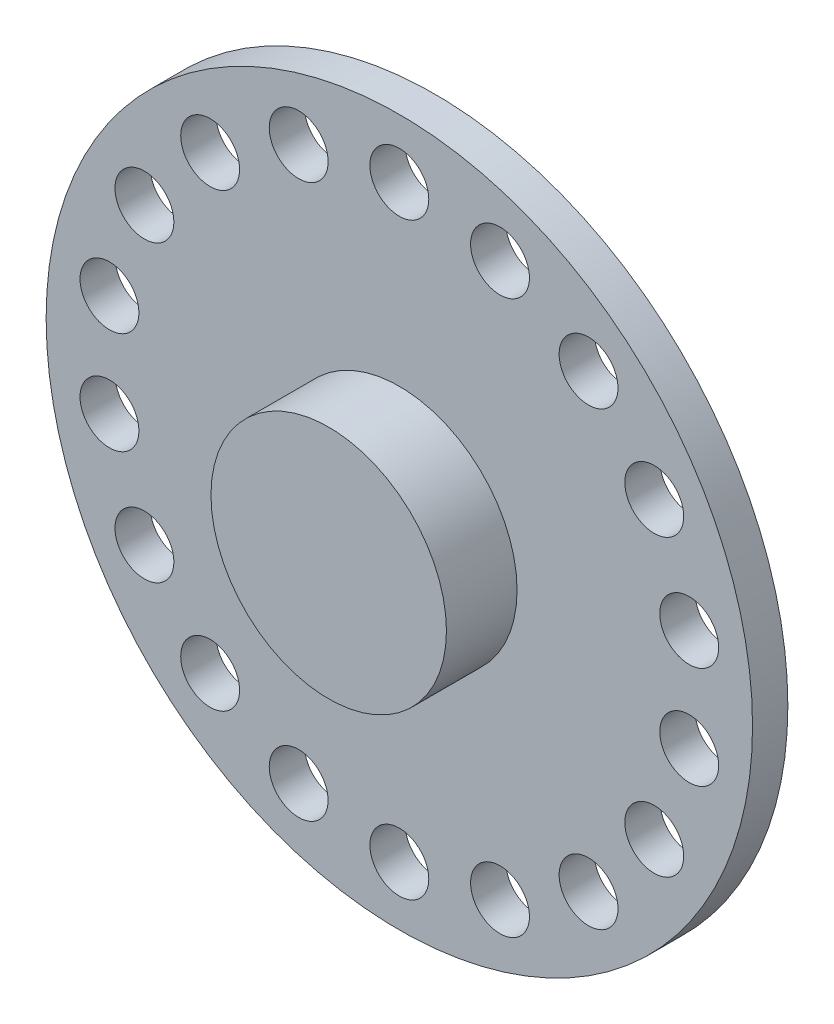
ISO-10303-21;
HEADER;
FILE_DESCRIPTION(('STEP AP214'),'2;1');
FILE_NAME('part.step','',(''),(''),'','','');
FILE_SCHEMA(('AUTOMOTIVE_DESIGN { 1 0 10303 214 1 1 1 1 }'));
ENDSEC;
DATA;
#1=APPLICATION_CONTEXT('core data for automotive mechanical design processes');
#2=APPLICATION_PROTOCOL_DEFINITION('international standard','automotive_design',2000,#1);
#3=PRODUCT_CONTEXT('',#1,'mechanical');
#4=PRODUCT('Part','Part','',(#3));
#5=PRODUCT_RELATED_PRODUCT_CATEGORY('part','',(#4));
#6=PRODUCT_DEFINITION_FORMATION('','',#4);
#7=PRODUCT_DEFINITION_CONTEXT('part definition',#1,'design');
#8=PRODUCT_DEFINITION('design','',#6,#7);
#9=PRODUCT_DEFINITION_SHAPE('','',#8);
#10=(LENGTH_UNIT() NAMED_UNIT(*) SI_UNIT(.MILLI.,.METRE.));
#11=(NAMED_UNIT(*) PLANE_ANGLE_UNIT() SI_UNIT($,.RADIAN.));
#12=(NAMED_UNIT(*) SI_UNIT($,.STERADIAN.) SOLID_ANGLE_UNIT());
#13=UNCERTAINTY_MEASURE_WITH_UNIT(LENGTH_MEASURE(1.E-05),#10,'distance_accuracy_value','');
#14=(GEOMETRIC_REPRESENTATION_CONTEXT(3) GLOBAL_UNCERTAINTY_ASSIGNED_CONTEXT((#13)) GLOBAL_UNIT_ASSIGNED_CONTEXT((#10,
#11,#12)) REPRESENTATION_CONTEXT('',''));
#15=CARTESIAN_POINT('',(0.,0.,0.));
#16=DIRECTION('',(0.,0.,1.));
#17=DIRECTION('',(1.,0.,0.));
#18=AXIS2_PLACEMENT_3D('',#15,#16,#17);
#19=CARTESIAN_POINT('',(0.,0.,3.));
#20=DIRECTION('',(0.,0.,-1.));
#21=DIRECTION('',(-1.,0.,0.));
#22=AXIS2_PLACEMENT_3D('',#19,#20,#21);
#23=CYLINDRICAL_SURFACE('',#22,30.);
#24=CARTESIAN_POINT('',(0.,0.,3.));
#25=DIRECTION('',(0.,0.,1.));
#26=DIRECTION('',(1.,0.,0.));
#27=AXIS2_PLACEMENT_3D('',#24,#25,#26);
#28=CIRCLE('',#27,30.);
#29=CARTESIAN_POINT('',(30.,0.,3.));
#30=VERTEX_POINT('',#29);
#31=EDGE_CURVE('E49',#30,#30,#28,.T.);
#32=ORIENTED_EDGE('',*,*,#31,.F.);
#33=EDGE_LOOP('',(#32));
#34=FACE_BOUND('',#33,.T.);
#35=CARTESIAN_POINT('',(0.,0.,0.));
#36=DIRECTION('',(0.,0.,1.));
#37=DIRECTION('',(1.,0.,0.));
#38=AXIS2_PLACEMENT_3D('',#35,#36,#37);
#39=CIRCLE('',#38,30.);
#40=CARTESIAN_POINT('',(30.,0.,0.));
#41=VERTEX_POINT('',#40);
#42=EDGE_CURVE('E44',#41,#41,#39,.T.);
#43=ORIENTED_EDGE('',*,*,#42,.T.);
#44=EDGE_LOOP('',(#43));
#45=FACE_BOUND('',#44,.T.);
#46=ADVANCED_FACE('F41',(#34,#45),#23,.T.);
#47=CARTESIAN_POINT('',(0.,0.,3.));
#48=DIRECTION('',(0.,0.,1.));
#49=DIRECTION('',(1.,0.,0.));
#50=AXIS2_PLACEMENT_3D('',#47,#48,#49);
#51=PLANE('',#50);
#52=CARTESIAN_POINT('',(-8.55050358314173,23.4923155196477,3.));
#53=DIRECTION('',(0.,0.,1.));
#54=DIRECTION('',(1.,0.,0.));
#55=AXIS2_PLACEMENT_3D('',#52,#53,#54);
#56=CIRCLE('',#55,2.5);
#57=CARTESIAN_POINT('',(-6.05050358314173,23.4923155196477,3.));
#58=VERTEX_POINT('',#57);
#59=EDGE_CURVE('E60',#58,#58,#56,.T.);
#60=ORIENTED_EDGE('',*,*,#59,.F.);
#61=EDGE_LOOP('',(#60));
#62=FACE_BOUND('',#61,.T.);
#63=CARTESIAN_POINT('',(-16.0696902421635,19.1511110779744,3.));
#64=DIRECTION('',(0.,0.,1.));
#65=DIRECTION('',(1.,0.,0.));
#66=AXIS2_PLACEMENT_3D('',#63,#64,#65);
#67=CIRCLE('',#66,2.5);
#68=CARTESIAN_POINT('',(-13.5696902421635,19.1511110779744,3.));
#69=VERTEX_POINT('',#68);
#70=EDGE_CURVE('E64',#69,#69,#67,.T.);
#71=ORIENTED_EDGE('',*,*,#70,.F.);
#72=EDGE_LOOP('',(#71));
#73=FACE_BOUND('',#72,.T.);
#74=CARTESIAN_POINT('',(-21.650635094611,12.5,3.));
#75=DIRECTION('',(0.,0.,1.));
#76=DIRECTION('',(1.,0.,0.));
#77=AXIS2_PLACEMENT_3D('',#74,#75,#76);
#78=CIRCLE('',#77,2.5);
#79=CARTESIAN_POINT('',(-19.150635094611,12.5,3.));
#80=VERTEX_POINT('',#79);
#81=EDGE_CURVE('E68',#80,#80,#78,.T.);
#82=ORIENTED_EDGE('',*,*,#81,.F.);
#83=EDGE_LOOP('',(#82));
#84=FACE_BOUND('',#83,.T.);
#85=CARTESIAN_POINT('',(-24.6201938253052,4.34120444167318,3.));
#86=DIRECTION('',(0.,0.,1.));
#87=DIRECTION('',(1.,0.,0.));
#88=AXIS2_PLACEMENT_3D('',#85,#86,#87);
#89=CIRCLE('',#88,2.5);
#90=CARTESIAN_POINT('',(-22.1201938253052,4.34120444167318,3.));
#91=VERTEX_POINT('',#90);
#92=EDGE_CURVE('E72',#91,#91,#89,.T.);
#93=ORIENTED_EDGE('',*,*,#92,.F.);
#94=EDGE_LOOP('',(#93));
#95=FACE_BOUND('',#94,.T.);
#96=CARTESIAN_POINT('',(-24.6201938253052,-4.34120444167335,3.));
#97=DIRECTION('',(0.,0.,1.));
#98=DIRECTION('',(1.,0.,0.));
#99=AXIS2_PLACEMENT_3D('',#96,#97,#98);
#100=CIRCLE('',#99,2.5);
#101=CARTESIAN_POINT('',(-22.1201938253052,-4.34120444167335,3.));
#102=VERTEX_POINT('',#101);
#103=EDGE_CURVE('E76',#102,#102,#100,.T.);
#104=ORIENTED_EDGE('',*,*,#103,.F.);
#105=EDGE_LOOP('',(#104));
#106=FACE_BOUND('',#105,.T.);
#107=CARTESIAN_POINT('',(-21.6506350946109,-12.5000000000001,3.));
#108=DIRECTION('',(0.,0.,1.));
#109=DIRECTION('',(1.,0.,0.));
#110=AXIS2_PLACEMENT_3D('',#107,#108,#109);
#111=CIRCLE('',#110,2.5);
#112=CARTESIAN_POINT('',(-19.1506350946109,-12.5000000000001,3.));
#113=VERTEX_POINT('',#112);
#114=EDGE_CURVE('E80',#113,#113,#111,.T.);
#115=ORIENTED_EDGE('',*,*,#114,.F.);
#116=EDGE_LOOP('',(#115));
#117=FACE_BOUND('',#116,.T.);
#118=CARTESIAN_POINT('',(-16.0696902421634,-19.1511110779745,3.));
#119=DIRECTION('',(0.,0.,1.));
#120=DIRECTION('',(1.,0.,0.));
#121=AXIS2_PLACEMENT_3D('',#118,#119,#120);
#122=CIRCLE('',#121,2.5);
#123=CARTESIAN_POINT('',(-13.5696902421634,-19.1511110779745,3.));
#124=VERTEX_POINT('',#123);
#125=EDGE_CURVE('E84',#124,#124,#122,.T.);
#126=ORIENTED_EDGE('',*,*,#125,.F.);
#127=EDGE_LOOP('',(#126));
#128=FACE_BOUND('',#127,.T.);
#129=CARTESIAN_POINT('',(-8.55050358314158,-23.4923155196478,3.));
#130=DIRECTION('',(0.,0.,1.));
#131=DIRECTION('',(1.,0.,0.));
#132=AXIS2_PLACEMENT_3D('',#129,#130,#131);
#133=CIRCLE('',#132,2.5);
#134=CARTESIAN_POINT('',(-6.05050358314158,-23.4923155196478,3.));
#135=VERTEX_POINT('',#134);
#136=EDGE_CURVE('E88',#135,#135,#133,.T.);
#137=ORIENTED_EDGE('',*,*,#136,.F.);
#138=EDGE_LOOP('',(#137));
#139=FACE_BOUND('',#138,.T.);
#140=CARTESIAN_POINT('',(1.74574066942157E-13,-25.,3.));
#141=DIRECTION('',(0.,0.,1.));
#142=DIRECTION('',(1.,0.,0.));
#143=AXIS2_PLACEMENT_3D('',#140,#141,#142);
#144=CIRCLE('',#143,2.5);
#145=CARTESIAN_POINT('',(2.50000000000017,-25.,3.));
#146=VERTEX_POINT('',#145);
#147=EDGE_CURVE('E92',#146,#146,#144,.T.);
#148=ORIENTED_EDGE('',*,*,#147,.F.);
#149=EDGE_LOOP('',(#148));
#150=FACE_BOUND('',#149,.T.);
#151=CARTESIAN_POINT('',(8.5505035831419,-23.4923155196476,3.));
#152=DIRECTION('',(0.,0.,1.));
#153=DIRECTION('',(1.,0.,0.));
#154=AXIS2_PLACEMENT_3D('',#151,#152,#153);
#155=CIRCLE('',#154,2.5);
#156=CARTESIAN_POINT('',(11.0505035831419,-23.4923155196476,3.));
#157=VERTEX_POINT('',#156);
#158=EDGE_CURVE('E96',#157,#157,#155,.T.);
#159=ORIENTED_EDGE('',*,*,#158,.F.);
#160=EDGE_LOOP('',(#159));
#161=FACE_BOUND('',#160,.T.);
#162=CARTESIAN_POINT('',(16.0696902421637,-19.1511110779743,3.));
#163=DIRECTION('',(0.,0.,1.));
#164=DIRECTION('',(1.,0.,0.));
#165=AXIS2_PLACEMENT_3D('',#162,#163,#164);
#166=CIRCLE('',#165,2.5);
#167=CARTESIAN_POINT('',(18.5696902421637,-19.1511110779743,3.));
#168=VERTEX_POINT('',#167);
#169=EDGE_CURVE('E100',#168,#168,#166,.T.);
#170=ORIENTED_EDGE('',*,*,#169,.F.);
#171=EDGE_LOOP('',(#170));
#172=FACE_BOUND('',#171,.T.);
#173=CARTESIAN_POINT('',(21.6506350946111,-12.4999999999998,3.));
#174=DIRECTION('',(0.,0.,1.));
#175=DIRECTION('',(1.,0.,0.));
#176=AXIS2_PLACEMENT_3D('',#173,#174,#175);
#177=CIRCLE('',#176,2.5);
#178=CARTESIAN_POINT('',(24.1506350946111,-12.4999999999998,3.));
#179=VERTEX_POINT('',#178);
#180=EDGE_CURVE('E104',#179,#179,#177,.T.);
#181=ORIENTED_EDGE('',*,*,#180,.F.);
#182=EDGE_LOOP('',(#181));
#183=FACE_BOUND('',#182,.T.);
#184=CARTESIAN_POINT('',(24.6201938253052,-4.34120444167302,3.));
#185=DIRECTION('',(0.,0.,1.));
#186=DIRECTION('',(1.,0.,0.));
#187=AXIS2_PLACEMENT_3D('',#184,#185,#186);
#188=CIRCLE('',#187,2.5);
#189=CARTESIAN_POINT('',(27.1201938253052,-4.34120444167302,3.));
#190=VERTEX_POINT('',#189);
#191=EDGE_CURVE('E108',#190,#190,#188,.T.);
#192=ORIENTED_EDGE('',*,*,#191,.F.);
#193=EDGE_LOOP('',(#192));
#194=FACE_BOUND('',#193,.T.);
#195=CARTESIAN_POINT('',(24.6201938253052,4.34120444167351,3.));
#196=DIRECTION('',(0.,0.,1.));
#197=DIRECTION('',(1.,0.,0.));
#198=AXIS2_PLACEMENT_3D('',#195,#196,#197);
#199=CIRCLE('',#198,2.5);
#200=CARTESIAN_POINT('',(27.1201938253052,4.34120444167351,3.));
#201=VERTEX_POINT('',#200);
#202=EDGE_CURVE('E112',#201,#201,#199,.T.);
#203=ORIENTED_EDGE('',*,*,#202,.F.);
#204=EDGE_LOOP('',(#203));
#205=FACE_BOUND('',#204,.T.);
#206=CARTESIAN_POINT('',(21.6506350946108,12.5000000000003,3.));
#207=DIRECTION('',(0.,0.,1.));
#208=DIRECTION('',(1.,0.,0.));
#209=AXIS2_PLACEMENT_3D('',#206,#207,#208);
#210=CIRCLE('',#209,2.5);
#211=CARTESIAN_POINT('',(24.1506350946108,12.5000000000003,3.));
#212=VERTEX_POINT('',#211);
#213=EDGE_CURVE('E116',#212,#212,#210,.T.);
#214=ORIENTED_EDGE('',*,*,#213,.F.);
#215=EDGE_LOOP('',(#214));
#216=FACE_BOUND('',#215,.T.);
#217=CARTESIAN_POINT('',(16.0696902421633,19.1511110779747,3.));
#218=DIRECTION('',(0.,0.,1.));
#219=DIRECTION('',(1.,0.,0.));
#220=AXIS2_PLACEMENT_3D('',#217,#218,#219);
#221=CIRCLE('',#220,2.5);
#222=CARTESIAN_POINT('',(18.5696902421633,19.1511110779747,3.));
#223=VERTEX_POINT('',#222);
#224=EDGE_CURVE('E120',#223,#223,#221,.T.);
#225=ORIENTED_EDGE('',*,*,#224,.F.);
#226=EDGE_LOOP('',(#225));
#227=FACE_BOUND('',#226,.T.);
#228=CARTESIAN_POINT('',(8.55050358314142,23.4923155196478,3.));
#229=DIRECTION('',(0.,0.,1.));
#230=DIRECTION('',(1.,0.,0.));
#231=AXIS2_PLACEMENT_3D('',#228,#229,#230);
#232=CIRCLE('',#231,2.5);
#233=CARTESIAN_POINT('',(11.0505035831414,23.4923155196478,3.));
#234=VERTEX_POINT('',#233);
#235=EDGE_CURVE('E124',#234,#234,#232,.T.);
#236=ORIENTED_EDGE('',*,*,#235,.F.);
#237=EDGE_LOOP('',(#236));
#238=FACE_BOUND('',#237,.T.);
#239=CARTESIAN_POINT('',(0.,25.,3.));
#240=DIRECTION('',(0.,0.,1.));
#241=DIRECTION('',(1.,0.,0.));
#242=AXIS2_PLACEMENT_3D('',#239,#240,#241);
#243=CIRCLE('',#242,2.5);
#244=CARTESIAN_POINT('',(2.5,25.,3.));
#245=VERTEX_POINT('',#244);
#246=EDGE_CURVE('E128',#245,#245,#243,.T.);
#247=ORIENTED_EDGE('',*,*,#246,.F.);
#248=EDGE_LOOP('',(#247));
#249=FACE_BOUND('',#248,.T.);
#250=CARTESIAN_POINT('',(0.,0.,3.));
#251=DIRECTION('',(0.,0.,1.));
#252=DIRECTION('',(1.,0.,0.));
#253=AXIS2_PLACEMENT_3D('',#250,#251,#252);
#254=CIRCLE('',#253,10.);
#255=CARTESIAN_POINT('',(10.,0.,3.));
#256=VERTEX_POINT('',#255);
#257=EDGE_CURVE('E10',#256,#256,#254,.T.);
#258=ORIENTED_EDGE('',*,*,#257,.F.);
#259=EDGE_LOOP('',(#258));
#260=FACE_BOUND('',#259,.T.);
#261=ORIENTED_EDGE('',*,*,#31,.T.);
#262=EDGE_LOOP('',(#261));
#263=FACE_BOUND('',#262,.T.);
#264=ADVANCED_FACE('F211',(#62,#73,#84,#95,#106,#117,#128,#139,#150,#161,#172,#183,#194,#205,
#216,#227,#238,#249,#260,#263),#51,.T.);
#265=CARTESIAN_POINT('',(0.,0.,0.));
#266=DIRECTION('',(0.,0.,1.));
#267=DIRECTION('',(1.,0.,0.));
#268=AXIS2_PLACEMENT_3D('',#265,#266,#267);
#269=PLANE('',#268);
#270=CARTESIAN_POINT('',(-8.55050358314173,23.4923155196477,0.));
#271=DIRECTION('',(0.,0.,-1.));
#272=DIRECTION('',(-1.,0.,0.));
#273=AXIS2_PLACEMENT_3D('',#270,#271,#272);
#274=CIRCLE('',#273,2.5);
#275=CARTESIAN_POINT('',(-11.0505035831417,23.4923155196477,0.));
#276=VERTEX_POINT('',#275);
#277=EDGE_CURVE('E136',#276,#276,#274,.T.);
#278=ORIENTED_EDGE('',*,*,#277,.F.);
#279=EDGE_LOOP('',(#278));
#280=FACE_BOUND('',#279,.T.);
#281=CARTESIAN_POINT('',(-16.0696902421635,19.1511110779744,0.));
#282=DIRECTION('',(0.,0.,-1.));
#283=DIRECTION('',(-1.,0.,0.));
#284=AXIS2_PLACEMENT_3D('',#281,#282,#283);
#285=CIRCLE('',#284,2.5);
#286=CARTESIAN_POINT('',(-18.5696902421635,19.1511110779744,0.));
#287=VERTEX_POINT('',#286);
#288=EDGE_CURVE('E194',#287,#287,#285,.T.);
#289=ORIENTED_EDGE('',*,*,#288,.F.);
#290=EDGE_LOOP('',(#289));
#291=FACE_BOUND('',#290,.T.);
#292=CARTESIAN_POINT('',(-21.650635094611,12.5,0.));
#293=DIRECTION('',(0.,0.,-1.));
#294=DIRECTION('',(-1.,0.,0.));
#295=AXIS2_PLACEMENT_3D('',#292,#293,#294);
#296=CIRCLE('',#295,2.5);
#297=CARTESIAN_POINT('',(-24.150635094611,12.5,0.));
#298=VERTEX_POINT('',#297);
#299=EDGE_CURVE('E190',#298,#298,#296,.T.);
#300=ORIENTED_EDGE('',*,*,#299,.F.);
#301=EDGE_LOOP('',(#300));
#302=FACE_BOUND('',#301,.T.);
#303=CARTESIAN_POINT('',(-24.6201938253052,4.34120444167318,0.));
#304=DIRECTION('',(0.,0.,-1.));
#305=DIRECTION('',(-1.,0.,0.));
#306=AXIS2_PLACEMENT_3D('',#303,#304,#305);
#307=CIRCLE('',#306,2.5);
#308=CARTESIAN_POINT('',(-27.1201938253052,4.34120444167318,0.));
#309=VERTEX_POINT('',#308);
#310=EDGE_CURVE('E186',#309,#309,#307,.T.);
#311=ORIENTED_EDGE('',*,*,#310,.F.);
#312=EDGE_LOOP('',(#311));
#313=FACE_BOUND('',#312,.T.);
#314=CARTESIAN_POINT('',(-24.6201938253052,-4.34120444167335,0.));
#315=DIRECTION('',(0.,0.,-1.));
#316=DIRECTION('',(-1.,0.,0.));
#317=AXIS2_PLACEMENT_3D('',#314,#315,#316);
#318=CIRCLE('',#317,2.5);
#319=CARTESIAN_POINT('',(-27.1201938253052,-4.34120444167335,0.));
#320=VERTEX_POINT('',#319);
#321=EDGE_CURVE('E182',#320,#320,#318,.T.);
#322=ORIENTED_EDGE('',*,*,#321,.F.);
#323=EDGE_LOOP('',(#322));
#324=FACE_BOUND('',#323,.T.);
#325=CARTESIAN_POINT('',(-21.6506350946109,-12.5000000000001,0.));
#326=DIRECTION('',(0.,0.,-1.));
#327=DIRECTION('',(-1.,0.,0.));
#328=AXIS2_PLACEMENT_3D('',#325,#326,#327);
#329=CIRCLE('',#328,2.5);
#330=CARTESIAN_POINT('',(-24.1506350946109,-12.5000000000001,0.));
#331=VERTEX_POINT('',#330);
#332=EDGE_CURVE('E178',#331,#331,#329,.T.);
#333=ORIENTED_EDGE('',*,*,#332,.F.);
#334=EDGE_LOOP('',(#333));
#335=FACE_BOUND('',#334,.T.);
#336=CARTESIAN_POINT('',(-16.0696902421634,-19.1511110779745,0.));
#337=DIRECTION('',(0.,0.,-1.));
#338=DIRECTION('',(-1.,0.,0.));
#339=AXIS2_PLACEMENT_3D('',#336,#337,#338);
#340=CIRCLE('',#339,2.5);
#341=CARTESIAN_POINT('',(-18.5696902421634,-19.1511110779745,0.));
#342=VERTEX_POINT('',#341);
#343=EDGE_CURVE('E174',#342,#342,#340,.T.);
#344=ORIENTED_EDGE('',*,*,#343,.F.);
#345=EDGE_LOOP('',(#344));
#346=FACE_BOUND('',#345,.T.);
#347=CARTESIAN_POINT('',(-8.55050358314158,-23.4923155196478,0.));
#348=DIRECTION('',(0.,0.,-1.));
#349=DIRECTION('',(-1.,0.,0.));
#350=AXIS2_PLACEMENT_3D('',#347,#348,#349);
#351=CIRCLE('',#350,2.5);
#352=CARTESIAN_POINT('',(-11.0505035831416,-23.4923155196478,0.));
#353=VERTEX_POINT('',#352);
#354=EDGE_CURVE('E170',#353,#353,#351,.T.);
#355=ORIENTED_EDGE('',*,*,#354,.F.);
#356=EDGE_LOOP('',(#355));
#357=FACE_BOUND('',#356,.T.);
#358=CARTESIAN_POINT('',(1.74574066942157E-13,-25.,0.));
#359=DIRECTION('',(0.,0.,-1.));
#360=DIRECTION('',(-1.,0.,0.));
#361=AXIS2_PLACEMENT_3D('',#358,#359,#360);
#362=CIRCLE('',#361,2.5);
#363=CARTESIAN_POINT('',(-2.49999999999982,-25.,0.));
#364=VERTEX_POINT('',#363);
#365=EDGE_CURVE('E166',#364,#364,#362,.T.);
#366=ORIENTED_EDGE('',*,*,#365,.F.);
#367=EDGE_LOOP('',(#366));
#368=FACE_BOUND('',#367,.T.);
#369=CARTESIAN_POINT('',(8.5505035831419,-23.4923155196476,0.));
#370=DIRECTION('',(0.,0.,-1.));
#371=DIRECTION('',(-1.,0.,0.));
#372=AXIS2_PLACEMENT_3D('',#369,#370,#371);
#373=CIRCLE('',#372,2.5);
#374=CARTESIAN_POINT('',(6.0505035831419,-23.4923155196476,0.));
#375=VERTEX_POINT('',#374);
#376=EDGE_CURVE('E162',#375,#375,#373,.T.);
#377=ORIENTED_EDGE('',*,*,#376,.F.);
#378=EDGE_LOOP('',(#377));
#379=FACE_BOUND('',#378,.T.);
#380=CARTESIAN_POINT('',(16.0696902421637,-19.1511110779743,0.));
#381=DIRECTION('',(0.,0.,-1.));
#382=DIRECTION('',(-1.,0.,0.));
#383=AXIS2_PLACEMENT_3D('',#380,#381,#382);
#384=CIRCLE('',#383,2.5);
#385=CARTESIAN_POINT('',(13.5696902421636,-19.1511110779743,0.));
#386=VERTEX_POINT('',#385);
#387=EDGE_CURVE('E158',#386,#386,#384,.T.);
#388=ORIENTED_EDGE('',*,*,#387,.F.);
#389=EDGE_LOOP('',(#388));
#390=FACE_BOUND('',#389,.T.);
#391=CARTESIAN_POINT('',(21.6506350946111,-12.4999999999998,0.));
#392=DIRECTION('',(0.,0.,-1.));
#393=DIRECTION('',(-1.,0.,0.));
#394=AXIS2_PLACEMENT_3D('',#391,#392,#393);
#395=CIRCLE('',#394,2.5);
#396=CARTESIAN_POINT('',(19.1506350946111,-12.4999999999998,0.));
#397=VERTEX_POINT('',#396);
#398=EDGE_CURVE('E154',#397,#397,#395,.T.);
#399=ORIENTED_EDGE('',*,*,#398,.F.);
#400=EDGE_LOOP('',(#399));
#401=FACE_BOUND('',#400,.T.);
#402=CARTESIAN_POINT('',(24.6201938253052,-4.34120444167302,0.));
#403=DIRECTION('',(0.,0.,-1.));
#404=DIRECTION('',(-1.,0.,0.));
#405=AXIS2_PLACEMENT_3D('',#402,#403,#404);
#406=CIRCLE('',#405,2.5);
#407=CARTESIAN_POINT('',(22.1201938253052,-4.34120444167302,0.));
#408=VERTEX_POINT('',#407);
#409=EDGE_CURVE('E150',#408,#408,#406,.T.);
#410=ORIENTED_EDGE('',*,*,#409,.F.);
#411=EDGE_LOOP('',(#410));
#412=FACE_BOUND('',#411,.T.);
#413=CARTESIAN_POINT('',(24.6201938253052,4.34120444167351,0.));
#414=DIRECTION('',(0.,0.,-1.));
#415=DIRECTION('',(-1.,0.,0.));
#416=AXIS2_PLACEMENT_3D('',#413,#414,#415);
#417=CIRCLE('',#416,2.5);
#418=CARTESIAN_POINT('',(22.1201938253052,4.34120444167351,0.));
#419=VERTEX_POINT('',#418);
#420=EDGE_CURVE('E146',#419,#419,#417,.T.);
#421=ORIENTED_EDGE('',*,*,#420,.F.);
#422=EDGE_LOOP('',(#421));
#423=FACE_BOUND('',#422,.T.);
#424=CARTESIAN_POINT('',(21.6506350946108,12.5000000000003,0.));
#425=DIRECTION('',(0.,0.,-1.));
#426=DIRECTION('',(-1.,0.,0.));
#427=AXIS2_PLACEMENT_3D('',#424,#425,#426);
#428=CIRCLE('',#427,2.5);
#429=CARTESIAN_POINT('',(19.1506350946108,12.5000000000003,0.));
#430=VERTEX_POINT('',#429);
#431=EDGE_CURVE('E141',#430,#430,#428,.T.);
#432=ORIENTED_EDGE('',*,*,#431,.F.);
#433=EDGE_LOOP('',(#432));
#434=FACE_BOUND('',#433,.T.);
#435=CARTESIAN_POINT('',(16.0696902421633,19.1511110779747,0.));
#436=DIRECTION('',(0.,0.,-1.));
#437=DIRECTION('',(-1.,0.,0.));
#438=AXIS2_PLACEMENT_3D('',#435,#436,#437);
#439=CIRCLE('',#438,2.5);
#440=CARTESIAN_POINT('',(13.5696902421633,19.1511110779747,0.));
#441=VERTEX_POINT('',#440);
#442=EDGE_CURVE('E137',#441,#441,#439,.T.);
#443=ORIENTED_EDGE('',*,*,#442,.F.);
#444=EDGE_LOOP('',(#443));
#445=FACE_BOUND('',#444,.T.);
#446=CARTESIAN_POINT('',(8.55050358314142,23.4923155196478,0.));
#447=DIRECTION('',(0.,0.,-1.));
#448=DIRECTION('',(-1.,0.,0.));
#449=AXIS2_PLACEMENT_3D('',#446,#447,#448);
#450=CIRCLE('',#449,2.5);
#451=CARTESIAN_POINT('',(6.05050358314142,23.4923155196478,0.));
#452=VERTEX_POINT('',#451);
#453=EDGE_CURVE('E142',#452,#452,#450,.T.);
#454=ORIENTED_EDGE('',*,*,#453,.F.);
#455=EDGE_LOOP('',(#454));
#456=FACE_BOUND('',#455,.T.);
#457=CARTESIAN_POINT('',(0.,25.,0.));
#458=DIRECTION('',(0.,0.,-1.));
#459=DIRECTION('',(-1.,0.,0.));
#460=AXIS2_PLACEMENT_3D('',#457,#458,#459);
#461=CIRCLE('',#460,2.5);
#462=CARTESIAN_POINT('',(-2.5,25.,0.));
#463=VERTEX_POINT('',#462);
#464=EDGE_CURVE('E132',#463,#463,#461,.T.);
#465=ORIENTED_EDGE('',*,*,#464,.F.);
#466=EDGE_LOOP('',(#465));
#467=FACE_BOUND('',#466,.T.);
#468=ORIENTED_EDGE('',*,*,#42,.F.);
#469=EDGE_LOOP('',(#468));
#470=FACE_BOUND('',#469,.T.);
#471=ADVANCED_FACE('F207',(#280,#291,#302,#313,#324,#335,#346,#357,#368,#379,#390,#401,#412,
#423,#434,#445,#456,#467,#470),#269,.F.);
#472=CARTESIAN_POINT('',(0.,0.,9.));
#473=DIRECTION('',(0.,0.,-1.));
#474=DIRECTION('',(-1.,0.,0.));
#475=AXIS2_PLACEMENT_3D('',#472,#473,#474);
#476=CYLINDRICAL_SURFACE('',#475,10.);
#477=CARTESIAN_POINT('',(0.,0.,9.));
#478=DIRECTION('',(0.,0.,1.));
#479=DIRECTION('',(1.,0.,0.));
#480=AXIS2_PLACEMENT_3D('',#477,#478,#479);
#481=CIRCLE('',#480,10.);
#482=CARTESIAN_POINT('',(10.,0.,9.));
#483=VERTEX_POINT('',#482);
#484=EDGE_CURVE('E56',#483,#483,#481,.T.);
#485=ORIENTED_EDGE('',*,*,#484,.F.);
#486=EDGE_LOOP('',(#485));
#487=FACE_BOUND('',#486,.T.);
#488=ORIENTED_EDGE('',*,*,#257,.T.);
#489=EDGE_LOOP('',(#488));
#490=FACE_BOUND('',#489,.T.);
#491=ADVANCED_FACE('F210',(#487,#490),#476,.T.);
#492=CARTESIAN_POINT('',(0.,0.,9.));
#493=DIRECTION('',(0.,0.,1.));
#494=DIRECTION('',(1.,0.,0.));
#495=AXIS2_PLACEMENT_3D('',#492,#493,#494);
#496=PLANE('',#495);
#497=ORIENTED_EDGE('',*,*,#484,.T.);
#498=EDGE_LOOP('',(#497));
#499=FACE_BOUND('',#498,.T.);
#500=ADVANCED_FACE('F235',(#499),#496,.T.);
#501=CARTESIAN_POINT('',(0.,25.,9.));
#502=DIRECTION('',(0.,0.,-1.));
#503=DIRECTION('',(-1.,0.,0.));
#504=AXIS2_PLACEMENT_3D('',#501,#502,#503);
#505=CYLINDRICAL_SURFACE('',#504,2.5);
#506=ORIENTED_EDGE('',*,*,#246,.T.);
#507=EDGE_LOOP('',(#506));
#508=FACE_BOUND('',#507,.T.);
#509=ORIENTED_EDGE('',*,*,#464,.T.);
#510=EDGE_LOOP('',(#509));
#511=FACE_BOUND('',#510,.T.);
#512=ADVANCED_FACE('F239',(#508,#511),#505,.F.);
#513=CARTESIAN_POINT('',(8.55050358314142,23.4923155196478,9.));
#514=DIRECTION('',(0.,0.,-1.));
#515=DIRECTION('',(-1.,0.,0.));
#516=AXIS2_PLACEMENT_3D('',#513,#514,#515);
#517=CYLINDRICAL_SURFACE('',#516,2.5);
#518=ORIENTED_EDGE('',*,*,#235,.T.);
#519=EDGE_LOOP('',(#518));
#520=FACE_BOUND('',#519,.T.);
#521=ORIENTED_EDGE('',*,*,#453,.T.);
#522=EDGE_LOOP('',(#521));
#523=FACE_BOUND('',#522,.T.);
#524=ADVANCED_FACE('F205',(#520,#523),#517,.F.);
#525=CARTESIAN_POINT('',(16.0696902421633,19.1511110779747,9.));
#526=DIRECTION('',(0.,0.,-1.));
#527=DIRECTION('',(-1.,0.,0.));
#528=AXIS2_PLACEMENT_3D('',#525,#526,#527);
#529=CYLINDRICAL_SURFACE('',#528,2.5);
#530=ORIENTED_EDGE('',*,*,#224,.T.);
#531=EDGE_LOOP('',(#530));
#532=FACE_BOUND('',#531,.T.);
#533=ORIENTED_EDGE('',*,*,#442,.T.);
#534=EDGE_LOOP('',(#533));
#535=FACE_BOUND('',#534,.T.);
#536=ADVANCED_FACE('F244',(#532,#535),#529,.F.);
#537=CARTESIAN_POINT('',(21.6506350946108,12.5000000000003,9.));
#538=DIRECTION('',(0.,0.,-1.));
#539=DIRECTION('',(-1.,0.,0.));
#540=AXIS2_PLACEMENT_3D('',#537,#538,#539);
#541=CYLINDRICAL_SURFACE('',#540,2.5);
#542=ORIENTED_EDGE('',*,*,#213,.T.);
#543=EDGE_LOOP('',(#542));
#544=FACE_BOUND('',#543,.T.);
#545=ORIENTED_EDGE('',*,*,#431,.T.);
#546=EDGE_LOOP('',(#545));
#547=FACE_BOUND('',#546,.T.);
#548=ADVANCED_FACE('F247',(#544,#547),#541,.F.);
#549=CARTESIAN_POINT('',(24.6201938253052,4.34120444167351,9.));
#550=DIRECTION('',(0.,0.,-1.));
#551=DIRECTION('',(-1.,0.,0.));
#552=AXIS2_PLACEMENT_3D('',#549,#550,#551);
#553=CYLINDRICAL_SURFACE('',#552,2.5);
#554=ORIENTED_EDGE('',*,*,#202,.T.);
#555=EDGE_LOOP('',(#554));
#556=FACE_BOUND('',#555,.T.);
#557=ORIENTED_EDGE('',*,*,#420,.T.);
#558=EDGE_LOOP('',(#557));
#559=FACE_BOUND('',#558,.T.);
#560=ADVANCED_FACE('F251',(#556,#559),#553,.F.);
#561=CARTESIAN_POINT('',(24.6201938253052,-4.34120444167302,9.));
#562=DIRECTION('',(0.,0.,-1.));
#563=DIRECTION('',(-1.,0.,0.));
#564=AXIS2_PLACEMENT_3D('',#561,#562,#563);
#565=CYLINDRICAL_SURFACE('',#564,2.5);
#566=ORIENTED_EDGE('',*,*,#191,.T.);
#567=EDGE_LOOP('',(#566));
#568=FACE_BOUND('',#567,.T.);
#569=ORIENTED_EDGE('',*,*,#409,.T.);
#570=EDGE_LOOP('',(#569));
#571=FACE_BOUND('',#570,.T.);
#572=ADVANCED_FACE('F255',(#568,#571),#565,.F.);
#573=CARTESIAN_POINT('',(21.6506350946111,-12.4999999999998,9.));
#574=DIRECTION('',(0.,0.,-1.));
#575=DIRECTION('',(-1.,0.,0.));
#576=AXIS2_PLACEMENT_3D('',#573,#574,#575);
#577=CYLINDRICAL_SURFACE('',#576,2.5);
#578=ORIENTED_EDGE('',*,*,#180,.T.);
#579=EDGE_LOOP('',(#578));
#580=FACE_BOUND('',#579,.T.);
#581=ORIENTED_EDGE('',*,*,#398,.T.);
#582=EDGE_LOOP('',(#581));
#583=FACE_BOUND('',#582,.T.);
#584=ADVANCED_FACE('F259',(#580,#583),#577,.F.);
#585=CARTESIAN_POINT('',(16.0696902421637,-19.1511110779743,9.));
#586=DIRECTION('',(0.,0.,-1.));
#587=DIRECTION('',(-1.,0.,0.));
#588=AXIS2_PLACEMENT_3D('',#585,#586,#587);
#589=CYLINDRICAL_SURFACE('',#588,2.5);
#590=ORIENTED_EDGE('',*,*,#169,.T.);
#591=EDGE_LOOP('',(#590));
#592=FACE_BOUND('',#591,.T.);
#593=ORIENTED_EDGE('',*,*,#387,.T.);
#594=EDGE_LOOP('',(#593));
#595=FACE_BOUND('',#594,.T.);
#596=ADVANCED_FACE('F263',(#592,#595),#589,.F.);
#597=CARTESIAN_POINT('',(8.5505035831419,-23.4923155196476,9.));
#598=DIRECTION('',(0.,0.,-1.));
#599=DIRECTION('',(-1.,0.,0.));
#600=AXIS2_PLACEMENT_3D('',#597,#598,#599);
#601=CYLINDRICAL_SURFACE('',#600,2.5);
#602=ORIENTED_EDGE('',*,*,#158,.T.);
#603=EDGE_LOOP('',(#602));
#604=FACE_BOUND('',#603,.T.);
#605=ORIENTED_EDGE('',*,*,#376,.T.);
#606=EDGE_LOOP('',(#605));
#607=FACE_BOUND('',#606,.T.);
#608=ADVANCED_FACE('F267',(#604,#607),#601,.F.);
#609=CARTESIAN_POINT('',(1.74574066942157E-13,-25.,9.));
#610=DIRECTION('',(0.,0.,-1.));
#611=DIRECTION('',(-1.,0.,0.));
#612=AXIS2_PLACEMENT_3D('',#609,#610,#611);
#613=CYLINDRICAL_SURFACE('',#612,2.5);
#614=ORIENTED_EDGE('',*,*,#147,.T.);
#615=EDGE_LOOP('',(#614));
#616=FACE_BOUND('',#615,.T.);
#617=ORIENTED_EDGE('',*,*,#365,.T.);
#618=EDGE_LOOP('',(#617));
#619=FACE_BOUND('',#618,.T.);
#620=ADVANCED_FACE('F271',(#616,#619),#613,.F.);
#621=CARTESIAN_POINT('',(-8.55050358314158,-23.4923155196478,9.));
#622=DIRECTION('',(0.,0.,-1.));
#623=DIRECTION('',(-1.,0.,0.));
#624=AXIS2_PLACEMENT_3D('',#621,#622,#623);
#625=CYLINDRICAL_SURFACE('',#624,2.5);
#626=ORIENTED_EDGE('',*,*,#136,.T.);
#627=EDGE_LOOP('',(#626));
#628=FACE_BOUND('',#627,.T.);
#629=ORIENTED_EDGE('',*,*,#354,.T.);
#630=EDGE_LOOP('',(#629));
#631=FACE_BOUND('',#630,.T.);
#632=ADVANCED_FACE('F275',(#628,#631),#625,.F.);
#633=CARTESIAN_POINT('',(-16.0696902421634,-19.1511110779745,9.));
#634=DIRECTION('',(0.,0.,-1.));
#635=DIRECTION('',(-1.,0.,0.));
#636=AXIS2_PLACEMENT_3D('',#633,#634,#635);
#637=CYLINDRICAL_SURFACE('',#636,2.5);
#638=ORIENTED_EDGE('',*,*,#125,.T.);
#639=EDGE_LOOP('',(#638));
#640=FACE_BOUND('',#639,.T.);
#641=ORIENTED_EDGE('',*,*,#343,.T.);
#642=EDGE_LOOP('',(#641));
#643=FACE_BOUND('',#642,.T.);
#644=ADVANCED_FACE('F279',(#640,#643),#637,.F.);
#645=CARTESIAN_POINT('',(-21.6506350946109,-12.5000000000001,9.));
#646=DIRECTION('',(0.,0.,-1.));
#647=DIRECTION('',(-1.,0.,0.));
#648=AXIS2_PLACEMENT_3D('',#645,#646,#647);
#649=CYLINDRICAL_SURFACE('',#648,2.5);
#650=ORIENTED_EDGE('',*,*,#114,.T.);
#651=EDGE_LOOP('',(#650));
#652=FACE_BOUND('',#651,.T.);
#653=ORIENTED_EDGE('',*,*,#332,.T.);
#654=EDGE_LOOP('',(#653));
#655=FACE_BOUND('',#654,.T.);
#656=ADVANCED_FACE('F283',(#652,#655),#649,.F.);
#657=CARTESIAN_POINT('',(-24.6201938253052,-4.34120444167335,9.));
#658=DIRECTION('',(0.,0.,-1.));
#659=DIRECTION('',(-1.,0.,0.));
#660=AXIS2_PLACEMENT_3D('',#657,#658,#659);
#661=CYLINDRICAL_SURFACE('',#660,2.5);
#662=ORIENTED_EDGE('',*,*,#103,.T.);
#663=EDGE_LOOP('',(#662));
#664=FACE_BOUND('',#663,.T.);
#665=ORIENTED_EDGE('',*,*,#321,.T.);
#666=EDGE_LOOP('',(#665));
#667=FACE_BOUND('',#666,.T.);
#668=ADVANCED_FACE('F287',(#664,#667),#661,.F.);
#669=CARTESIAN_POINT('',(-24.6201938253052,4.34120444167318,9.));
#670=DIRECTION('',(0.,0.,-1.));
#671=DIRECTION('',(-1.,0.,0.));
#672=AXIS2_PLACEMENT_3D('',#669,#670,#671);
#673=CYLINDRICAL_SURFACE('',#672,2.5);
#674=ORIENTED_EDGE('',*,*,#92,.T.);
#675=EDGE_LOOP('',(#674));
#676=FACE_BOUND('',#675,.T.);
#677=ORIENTED_EDGE('',*,*,#310,.T.);
#678=EDGE_LOOP('',(#677));
#679=FACE_BOUND('',#678,.T.);
#680=ADVANCED_FACE('F291',(#676,#679),#673,.F.);
#681=CARTESIAN_POINT('',(-21.650635094611,12.5,9.));
#682=DIRECTION('',(0.,0.,-1.));
#683=DIRECTION('',(-1.,0.,0.));
#684=AXIS2_PLACEMENT_3D('',#681,#682,#683);
#685=CYLINDRICAL_SURFACE('',#684,2.5);
#686=ORIENTED_EDGE('',*,*,#81,.T.);
#687=EDGE_LOOP('',(#686));
#688=FACE_BOUND('',#687,.T.);
#689=ORIENTED_EDGE('',*,*,#299,.T.);
#690=EDGE_LOOP('',(#689));
#691=FACE_BOUND('',#690,.T.);
#692=ADVANCED_FACE('F295',(#688,#691),#685,.F.);
#693=CARTESIAN_POINT('',(-16.0696902421635,19.1511110779744,9.));
#694=DIRECTION('',(0.,0.,-1.));
#695=DIRECTION('',(-1.,0.,0.));
#696=AXIS2_PLACEMENT_3D('',#693,#694,#695);
#697=CYLINDRICAL_SURFACE('',#696,2.5);
#698=ORIENTED_EDGE('',*,*,#70,.T.);
#699=EDGE_LOOP('',(#698));
#700=FACE_BOUND('',#699,.T.);
#701=ORIENTED_EDGE('',*,*,#288,.T.);
#702=EDGE_LOOP('',(#701));
#703=FACE_BOUND('',#702,.T.);
#704=ADVANCED_FACE('F299',(#700,#703),#697,.F.);
#705=CARTESIAN_POINT('',(-8.55050358314173,23.4923155196477,9.));
#706=DIRECTION('',(0.,0.,-1.));
#707=DIRECTION('',(-1.,0.,0.));
#708=AXIS2_PLACEMENT_3D('',#705,#706,#707);
#709=CYLINDRICAL_SURFACE('',#708,2.5);
#710=ORIENTED_EDGE('',*,*,#59,.T.);
#711=EDGE_LOOP('',(#710));
#712=FACE_BOUND('',#711,.T.);
#713=ORIENTED_EDGE('',*,*,#277,.T.);
#714=EDGE_LOOP('',(#713));
#715=FACE_BOUND('',#714,.T.);
#716=ADVANCED_FACE('F303',(#712,#715),#709,.F.);
#717=CLOSED_SHELL('',(#46,#264,#471,#491,#500,#512,#524,#536,#548,#560,#572,#584,#596,#608,#620,
#632,#644,#656,#668,#680,#692,#704,#716));
#718=MANIFOLD_SOLID_BREP('B2',#717);
#719=ADVANCED_BREP_SHAPE_REPRESENTATION('',(#18,#718),#14);
#720=SHAPE_DEFINITION_REPRESENTATION(#9,#719);
ENDSEC;
END-ISO-10303-21;
